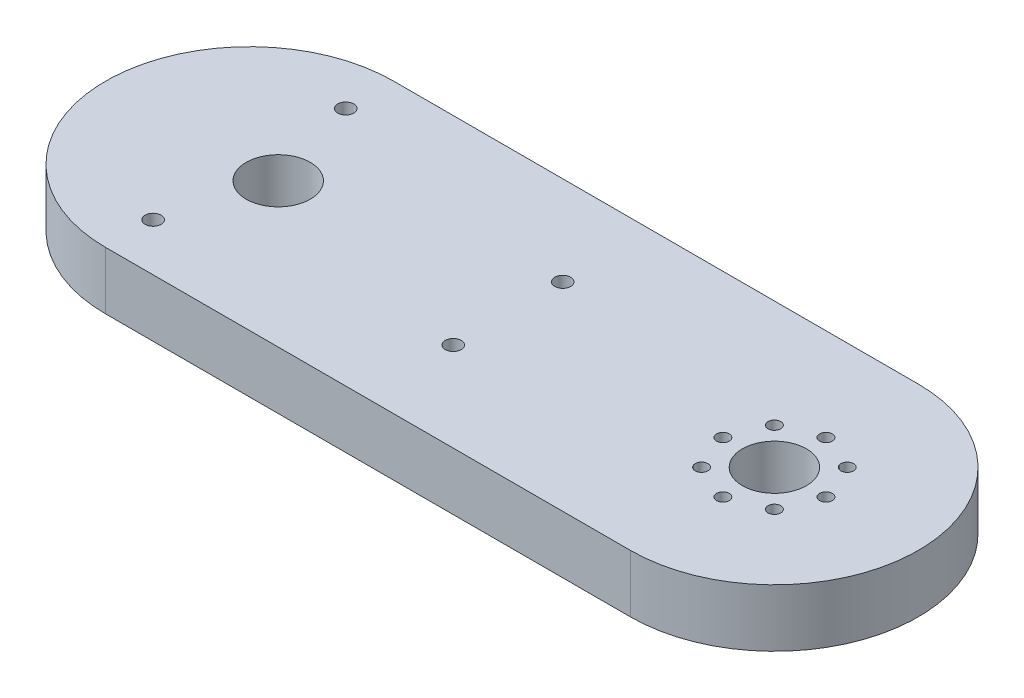
ISO-10303-21;
HEADER;
FILE_DESCRIPTION(('STEP AP214'),'2;1');
FILE_NAME('part.step','',(''),(''),'','','');
FILE_SCHEMA(('AUTOMOTIVE_DESIGN { 1 0 10303 214 1 1 1 1 }'));
ENDSEC;
DATA;
#1=APPLICATION_CONTEXT('core data for automotive mechanical design processes');
#2=APPLICATION_PROTOCOL_DEFINITION('international standard','automotive_design',2000,#1);
#3=PRODUCT_CONTEXT('',#1,'mechanical');
#4=PRODUCT('Part','Part','',(#3));
#5=PRODUCT_RELATED_PRODUCT_CATEGORY('part','',(#4));
#6=PRODUCT_DEFINITION_FORMATION('','',#4);
#7=PRODUCT_DEFINITION_CONTEXT('part definition',#1,'design');
#8=PRODUCT_DEFINITION('design','',#6,#7);
#9=PRODUCT_DEFINITION_SHAPE('','',#8);
#10=(LENGTH_UNIT() NAMED_UNIT(*) SI_UNIT(.MILLI.,.METRE.));
#11=(NAMED_UNIT(*) PLANE_ANGLE_UNIT() SI_UNIT($,.RADIAN.));
#12=(NAMED_UNIT(*) SI_UNIT($,.STERADIAN.) SOLID_ANGLE_UNIT());
#13=UNCERTAINTY_MEASURE_WITH_UNIT(LENGTH_MEASURE(1.E-05),#10,'distance_accuracy_value','');
#14=(GEOMETRIC_REPRESENTATION_CONTEXT(3) GLOBAL_UNCERTAINTY_ASSIGNED_CONTEXT((#13)) GLOBAL_UNIT_ASSIGNED_CONTEXT((#10,
#11,#12)) REPRESENTATION_CONTEXT('',''));
#15=CARTESIAN_POINT('',(0.,0.,0.));
#16=DIRECTION('',(0.,0.,1.));
#17=DIRECTION('',(1.,0.,0.));
#18=AXIS2_PLACEMENT_3D('',#15,#16,#17);
#19=CARTESIAN_POINT('',(41.,4.5,0.));
#20=DIRECTION('',(0.,-1.,0.));
#21=DIRECTION('',(0.,0.,-1.));
#22=AXIS2_PLACEMENT_3D('',#19,#20,#21);
#23=CYLINDRICAL_SURFACE('',#22,22.5);
#24=CARTESIAN_POINT('',(41.,-4.5,0.));
#25=DIRECTION('',(0.,1.,0.));
#26=DIRECTION('',(0.,0.,1.));
#27=AXIS2_PLACEMENT_3D('',#24,#25,#26);
#28=CIRCLE('',#27,22.5);
#29=CARTESIAN_POINT('',(41.,-4.5,22.5));
#30=VERTEX_POINT('',#29);
#31=CARTESIAN_POINT('',(41.,-4.5,-22.5));
#32=VERTEX_POINT('',#31);
#33=EDGE_CURVE('E106',#30,#32,#28,.T.);
#34=ORIENTED_EDGE('',*,*,#33,.T.);
#35=DIRECTION('',(0.,-1.,0.));
#36=VECTOR('',#35,1.);
#37=CARTESIAN_POINT('',(41.,4.5,-22.5));
#38=LINE('',#37,#36);
#39=CARTESIAN_POINT('',(41.,4.5,-22.5));
#40=VERTEX_POINT('',#39);
#41=EDGE_CURVE('E11',#40,#32,#38,.T.);
#42=ORIENTED_EDGE('',*,*,#41,.F.);
#43=CARTESIAN_POINT('',(41.,4.5,0.));
#44=DIRECTION('',(0.,1.,0.));
#45=DIRECTION('',(0.,0.,1.));
#46=AXIS2_PLACEMENT_3D('',#43,#44,#45);
#47=CIRCLE('',#46,22.5);
#48=CARTESIAN_POINT('',(41.,4.5,22.5));
#49=VERTEX_POINT('',#48);
#50=EDGE_CURVE('E90',#49,#40,#47,.T.);
#51=ORIENTED_EDGE('',*,*,#50,.F.);
#52=DIRECTION('',(0.,-1.,0.));
#53=VECTOR('',#52,1.);
#54=CARTESIAN_POINT('',(41.,4.5,22.5));
#55=LINE('',#54,#53);
#56=EDGE_CURVE('E102',#49,#30,#55,.T.);
#57=ORIENTED_EDGE('',*,*,#56,.T.);
#58=EDGE_LOOP('',(#34,#42,#51,#57));
#59=FACE_BOUND('',#58,.T.);
#60=ADVANCED_FACE('F38',(#59),#23,.T.);
#61=CARTESIAN_POINT('',(41.,4.5,-22.5));
#62=DIRECTION('',(0.,0.,1.));
#63=DIRECTION('',(1.,0.,0.));
#64=AXIS2_PLACEMENT_3D('',#61,#62,#63);
#65=PLANE('',#64);
#66=DIRECTION('',(-1.,0.,0.));
#67=VECTOR('',#66,1.);
#68=CARTESIAN_POINT('',(41.,-4.5,-22.5));
#69=LINE('',#68,#67);
#70=CARTESIAN_POINT('',(-41.,-4.5,-22.5));
#71=VERTEX_POINT('',#70);
#72=EDGE_CURVE('E95',#32,#71,#69,.T.);
#73=ORIENTED_EDGE('',*,*,#72,.T.);
#74=DIRECTION('',(0.,-1.,0.));
#75=VECTOR('',#74,1.);
#76=CARTESIAN_POINT('',(-41.,4.5,-22.5));
#77=LINE('',#76,#75);
#78=CARTESIAN_POINT('',(-41.,4.5,-22.5));
#79=VERTEX_POINT('',#78);
#80=EDGE_CURVE('E47',#79,#71,#77,.T.);
#81=ORIENTED_EDGE('',*,*,#80,.F.);
#82=DIRECTION('',(-1.,0.,0.));
#83=VECTOR('',#82,1.);
#84=CARTESIAN_POINT('',(41.,4.5,-22.5));
#85=LINE('',#84,#83);
#86=EDGE_CURVE('E85',#40,#79,#85,.T.);
#87=ORIENTED_EDGE('',*,*,#86,.F.);
#88=ORIENTED_EDGE('',*,*,#41,.T.);
#89=EDGE_LOOP('',(#73,#81,#87,#88));
#90=FACE_BOUND('',#89,.T.);
#91=ADVANCED_FACE('F94',(#90),#65,.F.);
#92=CARTESIAN_POINT('',(-41.,4.5,0.));
#93=DIRECTION('',(0.,-1.,0.));
#94=DIRECTION('',(0.,0.,-1.));
#95=AXIS2_PLACEMENT_3D('',#92,#93,#94);
#96=CYLINDRICAL_SURFACE('',#95,22.5);
#97=CARTESIAN_POINT('',(-41.,-4.5,0.));
#98=DIRECTION('',(0.,1.,0.));
#99=DIRECTION('',(0.,0.,1.));
#100=AXIS2_PLACEMENT_3D('',#97,#98,#99);
#101=CIRCLE('',#100,22.5);
#102=CARTESIAN_POINT('',(-41.,-4.5,22.5));
#103=VERTEX_POINT('',#102);
#104=EDGE_CURVE('E72',#71,#103,#101,.T.);
#105=ORIENTED_EDGE('',*,*,#104,.T.);
#106=DIRECTION('',(0.,-1.,0.));
#107=VECTOR('',#106,1.);
#108=CARTESIAN_POINT('',(-41.,4.5,22.5));
#109=LINE('',#108,#107);
#110=CARTESIAN_POINT('',(-41.,4.5,22.5));
#111=VERTEX_POINT('',#110);
#112=EDGE_CURVE('E97',#111,#103,#109,.T.);
#113=ORIENTED_EDGE('',*,*,#112,.F.);
#114=CARTESIAN_POINT('',(-41.,4.5,0.));
#115=DIRECTION('',(0.,1.,0.));
#116=DIRECTION('',(0.,0.,1.));
#117=AXIS2_PLACEMENT_3D('',#114,#115,#116);
#118=CIRCLE('',#117,22.5);
#119=EDGE_CURVE('E88',#79,#111,#118,.T.);
#120=ORIENTED_EDGE('',*,*,#119,.F.);
#121=ORIENTED_EDGE('',*,*,#80,.T.);
#122=EDGE_LOOP('',(#105,#113,#120,#121));
#123=FACE_BOUND('',#122,.T.);
#124=ADVANCED_FACE('F98',(#123),#96,.T.);
#125=CARTESIAN_POINT('',(41.,4.5,22.5));
#126=DIRECTION('',(0.,0.,-1.));
#127=DIRECTION('',(-1.,0.,0.));
#128=AXIS2_PLACEMENT_3D('',#125,#126,#127);
#129=PLANE('',#128);
#130=DIRECTION('',(1.,0.,0.));
#131=VECTOR('',#130,1.);
#132=CARTESIAN_POINT('',(41.,-4.5,22.5));
#133=LINE('',#132,#131);
#134=EDGE_CURVE('E78',#103,#30,#133,.T.);
#135=ORIENTED_EDGE('',*,*,#134,.T.);
#136=ORIENTED_EDGE('',*,*,#56,.F.);
#137=DIRECTION('',(1.,0.,0.));
#138=VECTOR('',#137,1.);
#139=CARTESIAN_POINT('',(41.,4.5,22.5));
#140=LINE('',#139,#138);
#141=EDGE_CURVE('E55',#111,#49,#140,.T.);
#142=ORIENTED_EDGE('',*,*,#141,.F.);
#143=ORIENTED_EDGE('',*,*,#112,.T.);
#144=EDGE_LOOP('',(#135,#136,#142,#143));
#145=FACE_BOUND('',#144,.T.);
#146=ADVANCED_FACE('F120',(#145),#129,.F.);
#147=CARTESIAN_POINT('',(41.,4.5,0.));
#148=DIRECTION('',(0.,1.,0.));
#149=DIRECTION('',(0.,0.,1.));
#150=AXIS2_PLACEMENT_3D('',#147,#148,#149);
#151=PLANE('',#150);
#152=CARTESIAN_POINT('',(-41.0250260676861,4.5,15.05));
#153=DIRECTION('',(0.,1.,0.));
#154=DIRECTION('',(0.,0.,1.));
#155=AXIS2_PLACEMENT_3D('',#152,#153,#154);
#156=CIRCLE('',#155,1.25);
#157=CARTESIAN_POINT('',(-41.0250260676861,4.5,16.3));
#158=VERTEX_POINT('',#157);
#159=EDGE_CURVE('E195',#158,#158,#156,.T.);
#160=ORIENTED_EDGE('',*,*,#159,.F.);
#161=EDGE_LOOP('',(#160));
#162=FACE_BOUND('',#161,.T.);
#163=CARTESIAN_POINT('',(-36.5250260676861,4.5,0.));
#164=DIRECTION('',(0.,1.,0.));
#165=DIRECTION('',(0.,0.,1.));
#166=AXIS2_PLACEMENT_3D('',#163,#164,#165);
#167=CIRCLE('',#166,5.);
#168=CARTESIAN_POINT('',(-36.5250260676861,4.5,5.));
#169=VERTEX_POINT('',#168);
#170=EDGE_CURVE('E202',#169,#169,#167,.T.);
#171=ORIENTED_EDGE('',*,*,#170,.F.);
#172=EDGE_LOOP('',(#171));
#173=FACE_BOUND('',#172,.T.);
#174=CARTESIAN_POINT('',(-0.625026067686098,4.5,-8.55));
#175=DIRECTION('',(0.,1.,0.));
#176=DIRECTION('',(0.,0.,1.));
#177=AXIS2_PLACEMENT_3D('',#174,#175,#176);
#178=CIRCLE('',#177,1.25);
#179=CARTESIAN_POINT('',(-0.625026067686098,4.5,-7.3));
#180=VERTEX_POINT('',#179);
#181=EDGE_CURVE('E206',#180,#180,#178,.T.);
#182=ORIENTED_EDGE('',*,*,#181,.F.);
#183=EDGE_LOOP('',(#182));
#184=FACE_BOUND('',#183,.T.);
#185=CARTESIAN_POINT('',(-0.625026067686098,4.5,8.55));
#186=DIRECTION('',(0.,1.,0.));
#187=DIRECTION('',(0.,0.,1.));
#188=AXIS2_PLACEMENT_3D('',#185,#186,#187);
#189=CIRCLE('',#188,1.25);
#190=CARTESIAN_POINT('',(-0.625026067686098,4.5,9.8));
#191=VERTEX_POINT('',#190);
#192=EDGE_CURVE('E210',#191,#191,#189,.T.);
#193=ORIENTED_EDGE('',*,*,#192,.F.);
#194=EDGE_LOOP('',(#193));
#195=FACE_BOUND('',#194,.T.);
#196=CARTESIAN_POINT('',(-41.0250260676861,4.5,-15.05));
#197=DIRECTION('',(0.,1.,0.));
#198=DIRECTION('',(0.,0.,1.));
#199=AXIS2_PLACEMENT_3D('',#196,#197,#198);
#200=CIRCLE('',#199,1.25);
#201=CARTESIAN_POINT('',(-41.0250260676861,4.5,-13.8));
#202=VERTEX_POINT('',#201);
#203=EDGE_CURVE('E214',#202,#202,#200,.T.);
#204=ORIENTED_EDGE('',*,*,#203,.F.);
#205=EDGE_LOOP('',(#204));
#206=FACE_BOUND('',#205,.T.);
#207=CARTESIAN_POINT('',(41.,4.5,0.));
#208=DIRECTION('',(0.,1.,0.));
#209=DIRECTION('',(0.,0.,1.));
#210=AXIS2_PLACEMENT_3D('',#207,#208,#209);
#211=CIRCLE('',#210,5.);
#212=CARTESIAN_POINT('',(41.,4.5,4.99999999999999));
#213=VERTEX_POINT('',#212);
#214=EDGE_CURVE('E191',#213,#213,#211,.T.);
#215=ORIENTED_EDGE('',*,*,#214,.F.);
#216=EDGE_LOOP('',(#215));
#217=FACE_BOUND('',#216,.T.);
#218=CARTESIAN_POINT('',(41.,4.5,-8.05000000000001));
#219=DIRECTION('',(0.,1.,0.));
#220=DIRECTION('',(0.,0.,1.));
#221=AXIS2_PLACEMENT_3D('',#218,#219,#220);
#222=CIRCLE('',#221,0.989999999999994);
#223=CARTESIAN_POINT('',(41.,4.5,-7.06000000000002));
#224=VERTEX_POINT('',#223);
#225=EDGE_CURVE('E110',#224,#224,#222,.T.);
#226=ORIENTED_EDGE('',*,*,#225,.F.);
#227=EDGE_LOOP('',(#226));
#228=FACE_BOUND('',#227,.T.);
#229=CARTESIAN_POINT('',(46.6922095885518,4.5,-5.69220958855188));
#230=DIRECTION('',(0.,1.,0.));
#231=DIRECTION('',(0.,0.,1.));
#232=AXIS2_PLACEMENT_3D('',#229,#230,#231);
#233=CIRCLE('',#232,0.989999999999996);
#234=CARTESIAN_POINT('',(46.6922095885518,4.5,-4.70220958855189));
#235=VERTEX_POINT('',#234);
#236=EDGE_CURVE('E130',#235,#235,#233,.T.);
#237=ORIENTED_EDGE('',*,*,#236,.F.);
#238=EDGE_LOOP('',(#237));
#239=FACE_BOUND('',#238,.T.);
#240=CARTESIAN_POINT('',(49.0500000000002,4.5,-2.15105711021124E-13));
#241=DIRECTION('',(0.,1.,0.));
#242=DIRECTION('',(0.,0.,1.));
#243=AXIS2_PLACEMENT_3D('',#240,#241,#242);
#244=CIRCLE('',#243,0.989999999999992);
#245=CARTESIAN_POINT('',(49.0500000000002,4.5,0.989999999999777));
#246=VERTEX_POINT('',#245);
#247=EDGE_CURVE('E134',#246,#246,#244,.T.);
#248=ORIENTED_EDGE('',*,*,#247,.F.);
#249=EDGE_LOOP('',(#248));
#250=FACE_BOUND('',#249,.T.);
#251=CARTESIAN_POINT('',(46.6922095885521,4.5,5.69220958855156));
#252=DIRECTION('',(0.,1.,0.));
#253=DIRECTION('',(0.,0.,1.));
#254=AXIS2_PLACEMENT_3D('',#251,#252,#253);
#255=CIRCLE('',#254,0.989999999999993);
#256=CARTESIAN_POINT('',(46.6922095885521,4.5,6.68220958855156));
#257=VERTEX_POINT('',#256);
#258=EDGE_CURVE('E138',#257,#257,#255,.T.);
#259=ORIENTED_EDGE('',*,*,#258,.F.);
#260=EDGE_LOOP('',(#259));
#261=FACE_BOUND('',#260,.T.);
#262=CARTESIAN_POINT('',(41.0000000000004,4.5,8.04999999999999));
#263=DIRECTION('',(0.,1.,0.));
#264=DIRECTION('',(0.,0.,1.));
#265=AXIS2_PLACEMENT_3D('',#262,#263,#264);
#266=CIRCLE('',#265,0.989999999999992);
#267=CARTESIAN_POINT('',(41.0000000000004,4.5,9.03999999999998));
#268=VERTEX_POINT('',#267);
#269=EDGE_CURVE('E142',#268,#268,#266,.T.);
#270=ORIENTED_EDGE('',*,*,#269,.F.);
#271=EDGE_LOOP('',(#270));
#272=FACE_BOUND('',#271,.T.);
#273=CARTESIAN_POINT('',(35.3077904114486,4.5,5.6922095885518));
#274=DIRECTION('',(0.,1.,0.));
#275=DIRECTION('',(0.,0.,1.));
#276=AXIS2_PLACEMENT_3D('',#273,#274,#275);
#277=CIRCLE('',#276,0.989999999999998);
#278=CARTESIAN_POINT('',(35.3077904114486,4.5,6.6822095885518));
#279=VERTEX_POINT('',#278);
#280=EDGE_CURVE('E146',#279,#279,#277,.T.);
#281=ORIENTED_EDGE('',*,*,#280,.F.);
#282=EDGE_LOOP('',(#281));
#283=FACE_BOUND('',#282,.T.);
#284=CARTESIAN_POINT('',(32.9500000000002,4.5,1.31838984174237E-13));
#285=DIRECTION('',(0.,1.,0.));
#286=DIRECTION('',(0.,0.,1.));
#287=AXIS2_PLACEMENT_3D('',#284,#285,#286);
#288=CIRCLE('',#287,0.989999999999999);
#289=CARTESIAN_POINT('',(32.9500000000002,4.5,0.990000000000131));
#290=VERTEX_POINT('',#289);
#291=EDGE_CURVE('E150',#290,#290,#288,.T.);
#292=ORIENTED_EDGE('',*,*,#291,.F.);
#293=EDGE_LOOP('',(#292));
#294=FACE_BOUND('',#293,.T.);
#295=CARTESIAN_POINT('',(35.3077904114484,4.5,-5.69220958855163));
#296=DIRECTION('',(0.,1.,0.));
#297=DIRECTION('',(0.,0.,1.));
#298=AXIS2_PLACEMENT_3D('',#295,#296,#297);
#299=CIRCLE('',#298,0.989999999999993);
#300=CARTESIAN_POINT('',(35.3077904114484,4.5,-4.70220958855163));
#301=VERTEX_POINT('',#300);
#302=EDGE_CURVE('E154',#301,#301,#299,.T.);
#303=ORIENTED_EDGE('',*,*,#302,.F.);
#304=EDGE_LOOP('',(#303));
#305=FACE_BOUND('',#304,.T.);
#306=ORIENTED_EDGE('',*,*,#50,.T.);
#307=ORIENTED_EDGE('',*,*,#86,.T.);
#308=ORIENTED_EDGE('',*,*,#119,.T.);
#309=ORIENTED_EDGE('',*,*,#141,.T.);
#310=EDGE_LOOP('',(#306,#307,#308,#309));
#311=FACE_BOUND('',#310,.T.);
#312=ADVANCED_FACE('F86',(#162,#173,#184,#195,#206,#217,#228,#239,#250,#261,#272,#283,#294,#305,
#311),#151,.T.);
#313=CARTESIAN_POINT('',(41.,-4.5,0.));
#314=DIRECTION('',(0.,1.,0.));
#315=DIRECTION('',(0.,0.,1.));
#316=AXIS2_PLACEMENT_3D('',#313,#314,#315);
#317=PLANE('',#316);
#318=CARTESIAN_POINT('',(-41.0250260676861,-4.5,15.05));
#319=DIRECTION('',(0.,1.,0.));
#320=DIRECTION('',(0.,0.,1.));
#321=AXIS2_PLACEMENT_3D('',#318,#319,#320);
#322=CIRCLE('',#321,1.25);
#323=CARTESIAN_POINT('',(-41.0250260676861,-4.5,16.3));
#324=VERTEX_POINT('',#323);
#325=EDGE_CURVE('E218',#324,#324,#322,.T.);
#326=ORIENTED_EDGE('',*,*,#325,.T.);
#327=EDGE_LOOP('',(#326));
#328=FACE_BOUND('',#327,.T.);
#329=CARTESIAN_POINT('',(-36.5250260676861,-4.5,0.));
#330=DIRECTION('',(0.,1.,0.));
#331=DIRECTION('',(0.,0.,1.));
#332=AXIS2_PLACEMENT_3D('',#329,#330,#331);
#333=CIRCLE('',#332,5.);
#334=CARTESIAN_POINT('',(-36.5250260676861,-4.5,5.));
#335=VERTEX_POINT('',#334);
#336=EDGE_CURVE('E228',#335,#335,#333,.T.);
#337=ORIENTED_EDGE('',*,*,#336,.T.);
#338=EDGE_LOOP('',(#337));
#339=FACE_BOUND('',#338,.T.);
#340=CARTESIAN_POINT('',(-0.625026067686098,-4.5,-8.55));
#341=DIRECTION('',(0.,1.,0.));
#342=DIRECTION('',(0.,0.,1.));
#343=AXIS2_PLACEMENT_3D('',#340,#341,#342);
#344=CIRCLE('',#343,1.25);
#345=CARTESIAN_POINT('',(-0.625026067686098,-4.5,-7.3));
#346=VERTEX_POINT('',#345);
#347=EDGE_CURVE('E224',#346,#346,#344,.T.);
#348=ORIENTED_EDGE('',*,*,#347,.T.);
#349=EDGE_LOOP('',(#348));
#350=FACE_BOUND('',#349,.T.);
#351=CARTESIAN_POINT('',(-0.625026067686098,-4.5,8.55));
#352=DIRECTION('',(0.,1.,0.));
#353=DIRECTION('',(0.,0.,-1.));
#354=AXIS2_PLACEMENT_3D('',#351,#352,#353);
#355=CIRCLE('',#354,1.25);
#356=CARTESIAN_POINT('',(-0.625026067686098,-4.5,7.3));
#357=VERTEX_POINT('',#356);
#358=EDGE_CURVE('E219',#357,#357,#355,.T.);
#359=ORIENTED_EDGE('',*,*,#358,.T.);
#360=EDGE_LOOP('',(#359));
#361=FACE_BOUND('',#360,.T.);
#362=CARTESIAN_POINT('',(-41.0250260676861,-4.5,-15.05));
#363=DIRECTION('',(0.,1.,0.));
#364=DIRECTION('',(0.,0.,1.));
#365=AXIS2_PLACEMENT_3D('',#362,#363,#364);
#366=CIRCLE('',#365,1.25);
#367=CARTESIAN_POINT('',(-41.0250260676861,-4.5,-13.8));
#368=VERTEX_POINT('',#367);
#369=EDGE_CURVE('E223',#368,#368,#366,.T.);
#370=ORIENTED_EDGE('',*,*,#369,.T.);
#371=EDGE_LOOP('',(#370));
#372=FACE_BOUND('',#371,.T.);
#373=CARTESIAN_POINT('',(41.,-4.5,0.));
#374=DIRECTION('',(0.,1.,0.));
#375=DIRECTION('',(0.,0.,1.));
#376=AXIS2_PLACEMENT_3D('',#373,#374,#375);
#377=CIRCLE('',#376,5.);
#378=CARTESIAN_POINT('',(41.,-4.5,4.99999999999999));
#379=VERTEX_POINT('',#378);
#380=EDGE_CURVE('E164',#379,#379,#377,.T.);
#381=ORIENTED_EDGE('',*,*,#380,.T.);
#382=EDGE_LOOP('',(#381));
#383=FACE_BOUND('',#382,.T.);
#384=CARTESIAN_POINT('',(41.,-4.5,-8.05000000000001));
#385=DIRECTION('',(0.,1.,0.));
#386=DIRECTION('',(0.,0.,1.));
#387=AXIS2_PLACEMENT_3D('',#384,#385,#386);
#388=CIRCLE('',#387,0.989999999999994);
#389=CARTESIAN_POINT('',(41.,-4.5,-7.06000000000002));
#390=VERTEX_POINT('',#389);
#391=EDGE_CURVE('E158',#390,#390,#388,.T.);
#392=ORIENTED_EDGE('',*,*,#391,.T.);
#393=EDGE_LOOP('',(#392));
#394=FACE_BOUND('',#393,.T.);
#395=CARTESIAN_POINT('',(46.6922095885518,-4.5,-5.69220958855188));
#396=DIRECTION('',(0.,1.,0.));
#397=DIRECTION('',(0.,0.,1.));
#398=AXIS2_PLACEMENT_3D('',#395,#396,#397);
#399=CIRCLE('',#398,0.989999999999996);
#400=CARTESIAN_POINT('',(46.6922095885518,-4.5,-4.70220958855189));
#401=VERTEX_POINT('',#400);
#402=EDGE_CURVE('E184',#401,#401,#399,.T.);
#403=ORIENTED_EDGE('',*,*,#402,.T.);
#404=EDGE_LOOP('',(#403));
#405=FACE_BOUND('',#404,.T.);
#406=CARTESIAN_POINT('',(49.0500000000002,-4.5,-2.15105711021124E-13));
#407=DIRECTION('',(0.,1.,0.));
#408=DIRECTION('',(0.,0.,1.));
#409=AXIS2_PLACEMENT_3D('',#406,#407,#408);
#410=CIRCLE('',#409,0.989999999999992);
#411=CARTESIAN_POINT('',(49.0500000000002,-4.5,0.989999999999777));
#412=VERTEX_POINT('',#411);
#413=EDGE_CURVE('E180',#412,#412,#410,.T.);
#414=ORIENTED_EDGE('',*,*,#413,.T.);
#415=EDGE_LOOP('',(#414));
#416=FACE_BOUND('',#415,.T.);
#417=CARTESIAN_POINT('',(46.6922095885521,-4.5,5.69220958855156));
#418=DIRECTION('',(0.,1.,0.));
#419=DIRECTION('',(0.,0.,1.));
#420=AXIS2_PLACEMENT_3D('',#417,#418,#419);
#421=CIRCLE('',#420,0.989999999999993);
#422=CARTESIAN_POINT('',(46.6922095885521,-4.5,6.68220958855156));
#423=VERTEX_POINT('',#422);
#424=EDGE_CURVE('E176',#423,#423,#421,.T.);
#425=ORIENTED_EDGE('',*,*,#424,.T.);
#426=EDGE_LOOP('',(#425));
#427=FACE_BOUND('',#426,.T.);
#428=CARTESIAN_POINT('',(41.0000000000004,-4.5,8.04999999999999));
#429=DIRECTION('',(0.,1.,0.));
#430=DIRECTION('',(0.,0.,1.));
#431=AXIS2_PLACEMENT_3D('',#428,#429,#430);
#432=CIRCLE('',#431,0.989999999999992);
#433=CARTESIAN_POINT('',(41.0000000000004,-4.5,9.03999999999998));
#434=VERTEX_POINT('',#433);
#435=EDGE_CURVE('E172',#434,#434,#432,.T.);
#436=ORIENTED_EDGE('',*,*,#435,.T.);
#437=EDGE_LOOP('',(#436));
#438=FACE_BOUND('',#437,.T.);
#439=CARTESIAN_POINT('',(35.3077904114486,-4.5,5.6922095885518));
#440=DIRECTION('',(0.,1.,0.));
#441=DIRECTION('',(0.,0.,1.));
#442=AXIS2_PLACEMENT_3D('',#439,#440,#441);
#443=CIRCLE('',#442,0.989999999999998);
#444=CARTESIAN_POINT('',(35.3077904114486,-4.5,6.6822095885518));
#445=VERTEX_POINT('',#444);
#446=EDGE_CURVE('E168',#445,#445,#443,.T.);
#447=ORIENTED_EDGE('',*,*,#446,.T.);
#448=EDGE_LOOP('',(#447));
#449=FACE_BOUND('',#448,.T.);
#450=CARTESIAN_POINT('',(32.9500000000002,-4.5,1.31838984174237E-13));
#451=DIRECTION('',(0.,1.,0.));
#452=DIRECTION('',(0.,0.,1.));
#453=AXIS2_PLACEMENT_3D('',#450,#451,#452);
#454=CIRCLE('',#453,0.989999999999999);
#455=CARTESIAN_POINT('',(32.9500000000002,-4.5,0.990000000000131));
#456=VERTEX_POINT('',#455);
#457=EDGE_CURVE('E163',#456,#456,#454,.T.);
#458=ORIENTED_EDGE('',*,*,#457,.T.);
#459=EDGE_LOOP('',(#458));
#460=FACE_BOUND('',#459,.T.);
#461=CARTESIAN_POINT('',(35.3077904114484,-4.5,-5.69220958855163));
#462=DIRECTION('',(0.,1.,0.));
#463=DIRECTION('',(0.,0.,1.));
#464=AXIS2_PLACEMENT_3D('',#461,#462,#463);
#465=CIRCLE('',#464,0.989999999999993);
#466=CARTESIAN_POINT('',(35.3077904114484,-4.5,-4.70220958855163));
#467=VERTEX_POINT('',#466);
#468=EDGE_CURVE('E159',#467,#467,#465,.T.);
#469=ORIENTED_EDGE('',*,*,#468,.T.);
#470=EDGE_LOOP('',(#469));
#471=FACE_BOUND('',#470,.T.);
#472=ORIENTED_EDGE('',*,*,#33,.F.);
#473=ORIENTED_EDGE('',*,*,#134,.F.);
#474=ORIENTED_EDGE('',*,*,#104,.F.);
#475=ORIENTED_EDGE('',*,*,#72,.F.);
#476=EDGE_LOOP('',(#472,#473,#474,#475));
#477=FACE_BOUND('',#476,.T.);
#478=ADVANCED_FACE('F123',(#328,#339,#350,#361,#372,#383,#394,#405,#416,#427,#438,#449,#460,
#471,#477),#317,.F.);
#479=CARTESIAN_POINT('',(35.3077904114484,-4.5,-5.69220958855163));
#480=DIRECTION('',(0.,1.,0.));
#481=DIRECTION('',(0.,0.,1.));
#482=AXIS2_PLACEMENT_3D('',#479,#480,#481);
#483=CYLINDRICAL_SURFACE('',#482,0.989999999999993);
#484=ORIENTED_EDGE('',*,*,#302,.T.);
#485=EDGE_LOOP('',(#484));
#486=FACE_BOUND('',#485,.T.);
#487=ORIENTED_EDGE('',*,*,#468,.F.);
#488=EDGE_LOOP('',(#487));
#489=FACE_BOUND('',#488,.T.);
#490=ADVANCED_FACE('F266',(#486,#489),#483,.F.);
#491=CARTESIAN_POINT('',(32.9500000000002,-4.5,1.31838984174237E-13));
#492=DIRECTION('',(0.,1.,0.));
#493=DIRECTION('',(0.,0.,1.));
#494=AXIS2_PLACEMENT_3D('',#491,#492,#493);
#495=CYLINDRICAL_SURFACE('',#494,0.989999999999999);
#496=ORIENTED_EDGE('',*,*,#291,.T.);
#497=EDGE_LOOP('',(#496));
#498=FACE_BOUND('',#497,.T.);
#499=ORIENTED_EDGE('',*,*,#457,.F.);
#500=EDGE_LOOP('',(#499));
#501=FACE_BOUND('',#500,.T.);
#502=ADVANCED_FACE('F272',(#498,#501),#495,.F.);
#503=CARTESIAN_POINT('',(35.3077904114486,-4.5,5.6922095885518));
#504=DIRECTION('',(0.,1.,0.));
#505=DIRECTION('',(0.,0.,1.));
#506=AXIS2_PLACEMENT_3D('',#503,#504,#505);
#507=CYLINDRICAL_SURFACE('',#506,0.989999999999998);
#508=ORIENTED_EDGE('',*,*,#280,.T.);
#509=EDGE_LOOP('',(#508));
#510=FACE_BOUND('',#509,.T.);
#511=ORIENTED_EDGE('',*,*,#446,.F.);
#512=EDGE_LOOP('',(#511));
#513=FACE_BOUND('',#512,.T.);
#514=ADVANCED_FACE('F276',(#510,#513),#507,.F.);
#515=CARTESIAN_POINT('',(41.0000000000004,-4.5,8.04999999999999));
#516=DIRECTION('',(0.,1.,0.));
#517=DIRECTION('',(0.,0.,1.));
#518=AXIS2_PLACEMENT_3D('',#515,#516,#517);
#519=CYLINDRICAL_SURFACE('',#518,0.989999999999992);
#520=ORIENTED_EDGE('',*,*,#269,.T.);
#521=EDGE_LOOP('',(#520));
#522=FACE_BOUND('',#521,.T.);
#523=ORIENTED_EDGE('',*,*,#435,.F.);
#524=EDGE_LOOP('',(#523));
#525=FACE_BOUND('',#524,.T.);
#526=ADVANCED_FACE('F280',(#522,#525),#519,.F.);
#527=CARTESIAN_POINT('',(46.6922095885521,-4.5,5.69220958855156));
#528=DIRECTION('',(0.,1.,0.));
#529=DIRECTION('',(0.,0.,1.));
#530=AXIS2_PLACEMENT_3D('',#527,#528,#529);
#531=CYLINDRICAL_SURFACE('',#530,0.989999999999993);
#532=ORIENTED_EDGE('',*,*,#258,.T.);
#533=EDGE_LOOP('',(#532));
#534=FACE_BOUND('',#533,.T.);
#535=ORIENTED_EDGE('',*,*,#424,.F.);
#536=EDGE_LOOP('',(#535));
#537=FACE_BOUND('',#536,.T.);
#538=ADVANCED_FACE('F284',(#534,#537),#531,.F.);
#539=CARTESIAN_POINT('',(49.0500000000002,-4.5,-2.15105711021124E-13));
#540=DIRECTION('',(0.,1.,0.));
#541=DIRECTION('',(0.,0.,1.));
#542=AXIS2_PLACEMENT_3D('',#539,#540,#541);
#543=CYLINDRICAL_SURFACE('',#542,0.989999999999992);
#544=ORIENTED_EDGE('',*,*,#247,.T.);
#545=EDGE_LOOP('',(#544));
#546=FACE_BOUND('',#545,.T.);
#547=ORIENTED_EDGE('',*,*,#413,.F.);
#548=EDGE_LOOP('',(#547));
#549=FACE_BOUND('',#548,.T.);
#550=ADVANCED_FACE('F288',(#546,#549),#543,.F.);
#551=CARTESIAN_POINT('',(46.6922095885518,-4.5,-5.69220958855188));
#552=DIRECTION('',(0.,1.,0.));
#553=DIRECTION('',(0.,0.,1.));
#554=AXIS2_PLACEMENT_3D('',#551,#552,#553);
#555=CYLINDRICAL_SURFACE('',#554,0.989999999999996);
#556=ORIENTED_EDGE('',*,*,#236,.T.);
#557=EDGE_LOOP('',(#556));
#558=FACE_BOUND('',#557,.T.);
#559=ORIENTED_EDGE('',*,*,#402,.F.);
#560=EDGE_LOOP('',(#559));
#561=FACE_BOUND('',#560,.T.);
#562=ADVANCED_FACE('F292',(#558,#561),#555,.F.);
#563=CARTESIAN_POINT('',(41.,-4.5,-8.05000000000001));
#564=DIRECTION('',(0.,1.,0.));
#565=DIRECTION('',(0.,0.,1.));
#566=AXIS2_PLACEMENT_3D('',#563,#564,#565);
#567=CYLINDRICAL_SURFACE('',#566,0.989999999999994);
#568=ORIENTED_EDGE('',*,*,#225,.T.);
#569=EDGE_LOOP('',(#568));
#570=FACE_BOUND('',#569,.T.);
#571=ORIENTED_EDGE('',*,*,#391,.F.);
#572=EDGE_LOOP('',(#571));
#573=FACE_BOUND('',#572,.T.);
#574=ADVANCED_FACE('F296',(#570,#573),#567,.F.);
#575=CARTESIAN_POINT('',(41.,-4.5,0.));
#576=DIRECTION('',(0.,1.,0.));
#577=DIRECTION('',(0.,0.,1.));
#578=AXIS2_PLACEMENT_3D('',#575,#576,#577);
#579=CYLINDRICAL_SURFACE('',#578,5.);
#580=ORIENTED_EDGE('',*,*,#380,.F.);
#581=EDGE_LOOP('',(#580));
#582=FACE_BOUND('',#581,.T.);
#583=ORIENTED_EDGE('',*,*,#214,.T.);
#584=EDGE_LOOP('',(#583));
#585=FACE_BOUND('',#584,.T.);
#586=ADVANCED_FACE('F300',(#582,#585),#579,.F.);
#587=CARTESIAN_POINT('',(-41.0250260676861,-4.5,-15.05));
#588=DIRECTION('',(0.,1.,0.));
#589=DIRECTION('',(0.,0.,1.));
#590=AXIS2_PLACEMENT_3D('',#587,#588,#589);
#591=CYLINDRICAL_SURFACE('',#590,1.25);
#592=ORIENTED_EDGE('',*,*,#203,.T.);
#593=EDGE_LOOP('',(#592));
#594=FACE_BOUND('',#593,.T.);
#595=ORIENTED_EDGE('',*,*,#369,.F.);
#596=EDGE_LOOP('',(#595));
#597=FACE_BOUND('',#596,.T.);
#598=ADVANCED_FACE('F304',(#594,#597),#591,.F.);
#599=CARTESIAN_POINT('',(-0.625026067686098,-4.5,8.55));
#600=DIRECTION('',(0.,1.,0.));
#601=DIRECTION('',(0.,0.,1.));
#602=AXIS2_PLACEMENT_3D('',#599,#600,#601);
#603=CYLINDRICAL_SURFACE('',#602,1.25);
#604=ORIENTED_EDGE('',*,*,#192,.T.);
#605=EDGE_LOOP('',(#604));
#606=FACE_BOUND('',#605,.T.);
#607=ORIENTED_EDGE('',*,*,#358,.F.);
#608=EDGE_LOOP('',(#607));
#609=FACE_BOUND('',#608,.T.);
#610=ADVANCED_FACE('F306',(#606,#609),#603,.F.);
#611=CARTESIAN_POINT('',(-0.625026067686098,-4.5,-8.55));
#612=DIRECTION('',(0.,1.,0.));
#613=DIRECTION('',(0.,0.,1.));
#614=AXIS2_PLACEMENT_3D('',#611,#612,#613);
#615=CYLINDRICAL_SURFACE('',#614,1.25);
#616=ORIENTED_EDGE('',*,*,#181,.T.);
#617=EDGE_LOOP('',(#616));
#618=FACE_BOUND('',#617,.T.);
#619=ORIENTED_EDGE('',*,*,#347,.F.);
#620=EDGE_LOOP('',(#619));
#621=FACE_BOUND('',#620,.T.);
#622=ADVANCED_FACE('F249',(#618,#621),#615,.F.);
#623=CARTESIAN_POINT('',(-36.5250260676861,-4.5,0.));
#624=DIRECTION('',(0.,1.,0.));
#625=DIRECTION('',(0.,0.,1.));
#626=AXIS2_PLACEMENT_3D('',#623,#624,#625);
#627=CYLINDRICAL_SURFACE('',#626,5.);
#628=ORIENTED_EDGE('',*,*,#170,.T.);
#629=EDGE_LOOP('',(#628));
#630=FACE_BOUND('',#629,.T.);
#631=ORIENTED_EDGE('',*,*,#336,.F.);
#632=EDGE_LOOP('',(#631));
#633=FACE_BOUND('',#632,.T.);
#634=ADVANCED_FACE('F243',(#630,#633),#627,.F.);
#635=CARTESIAN_POINT('',(-41.0250260676861,-4.5,15.05));
#636=DIRECTION('',(0.,1.,0.));
#637=DIRECTION('',(0.,0.,1.));
#638=AXIS2_PLACEMENT_3D('',#635,#636,#637);
#639=CYLINDRICAL_SURFACE('',#638,1.25);
#640=ORIENTED_EDGE('',*,*,#159,.T.);
#641=EDGE_LOOP('',(#640));
#642=FACE_BOUND('',#641,.T.);
#643=ORIENTED_EDGE('',*,*,#325,.F.);
#644=EDGE_LOOP('',(#643));
#645=FACE_BOUND('',#644,.T.);
#646=ADVANCED_FACE('F241',(#642,#645),#639,.F.);
#647=CLOSED_SHELL('',(#60,#91,#124,#146,#312,#478,#490,#502,#514,#526,#538,#550,#562,#574,#586,
#598,#610,#622,#634,#646));
#648=MANIFOLD_SOLID_BREP('B2',#647);
#649=ADVANCED_BREP_SHAPE_REPRESENTATION('',(#18,#648),#14);
#650=SHAPE_DEFINITION_REPRESENTATION(#9,#649);
ENDSEC;
END-ISO-10303-21;
